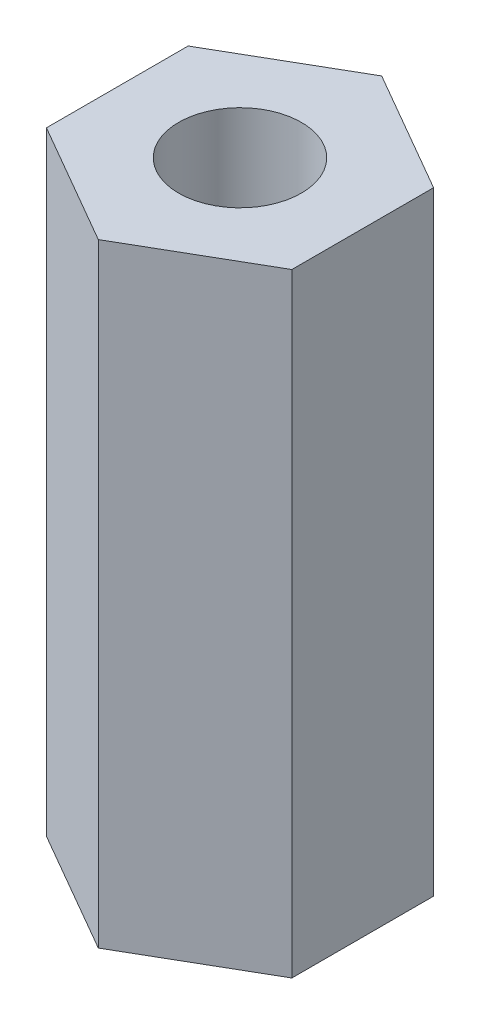
ISO-10303-21;
HEADER;
FILE_DESCRIPTION(('STEP AP214'),'2;1');
FILE_NAME('part.step','',(''),(''),'','','');
FILE_SCHEMA(('AUTOMOTIVE_DESIGN { 1 0 10303 214 1 1 1 1 }'));
ENDSEC;
DATA;
#1=APPLICATION_CONTEXT('core data for automotive mechanical design processes');
#2=APPLICATION_PROTOCOL_DEFINITION('international standard','automotive_design',2000,#1);
#3=PRODUCT_CONTEXT('',#1,'mechanical');
#4=PRODUCT('Part','Part','',(#3));
#5=PRODUCT_RELATED_PRODUCT_CATEGORY('part','',(#4));
#6=PRODUCT_DEFINITION_FORMATION('','',#4);
#7=PRODUCT_DEFINITION_CONTEXT('part definition',#1,'design');
#8=PRODUCT_DEFINITION('design','',#6,#7);
#9=PRODUCT_DEFINITION_SHAPE('','',#8);
#10=(LENGTH_UNIT() NAMED_UNIT(*) SI_UNIT(.MILLI.,.METRE.));
#11=(NAMED_UNIT(*) PLANE_ANGLE_UNIT() SI_UNIT($,.RADIAN.));
#12=(NAMED_UNIT(*) SI_UNIT($,.STERADIAN.) SOLID_ANGLE_UNIT());
#13=UNCERTAINTY_MEASURE_WITH_UNIT(LENGTH_MEASURE(1.E-05),#10,'distance_accuracy_value','');
#14=(GEOMETRIC_REPRESENTATION_CONTEXT(3) GLOBAL_UNCERTAINTY_ASSIGNED_CONTEXT((#13)) GLOBAL_UNIT_ASSIGNED_CONTEXT((#10,
#11,#12)) REPRESENTATION_CONTEXT('',''));
#15=CARTESIAN_POINT('',(0.,0.,0.));
#16=DIRECTION('',(0.,0.,1.));
#17=DIRECTION('',(1.,0.,0.));
#18=AXIS2_PLACEMENT_3D('',#15,#16,#17);
#19=CARTESIAN_POINT('',(0.,15.,0.));
#20=DIRECTION('',(0.,1.,0.));
#21=DIRECTION('',(0.,0.,1.));
#22=AXIS2_PLACEMENT_3D('',#19,#20,#21);
#23=PLANE('',#22);
#24=DIRECTION('',(-0.866025403784442,0.,-0.499999999999995));
#25=VECTOR('',#24,1.);
#26=CARTESIAN_POINT('',(2.99999999999998,15.,-1.73205080756891));
#27=LINE('',#26,#25);
#28=CARTESIAN_POINT('',(2.99999999999998,15.,-1.73205080756891));
#29=VERTEX_POINT('',#28);
#30=CARTESIAN_POINT('',(0.,15.,-3.46410161513776));
#31=VERTEX_POINT('',#30);
#32=EDGE_CURVE('E148',#29,#31,#27,.T.);
#33=ORIENTED_EDGE('',*,*,#32,.T.);
#34=DIRECTION('',(-0.866025403784438,0.,0.500000000000001));
#35=VECTOR('',#34,1.);
#36=CARTESIAN_POINT('',(0.,15.,-3.46410161513776));
#37=LINE('',#36,#35);
#38=CARTESIAN_POINT('',(-3.00000000000001,15.,-1.73205080756887));
#39=VERTEX_POINT('',#38);
#40=EDGE_CURVE('E96',#31,#39,#37,.T.);
#41=ORIENTED_EDGE('',*,*,#40,.T.);
#42=DIRECTION('',(0.,0.,1.));
#43=VECTOR('',#42,1.);
#44=CARTESIAN_POINT('',(-3.00000000000001,15.,-1.73205080756887));
#45=LINE('',#44,#43);
#46=CARTESIAN_POINT('',(-2.99999999999999,15.,1.73205080756889));
#47=VERTEX_POINT('',#46);
#48=EDGE_CURVE('E109',#39,#47,#45,.T.);
#49=ORIENTED_EDGE('',*,*,#48,.T.);
#50=DIRECTION('',(0.866025403784442,0.,0.499999999999995));
#51=VECTOR('',#50,1.);
#52=CARTESIAN_POINT('',(-2.99999999999999,15.,1.73205080756889));
#53=LINE('',#52,#51);
#54=CARTESIAN_POINT('',(0.,15.,3.46410161513776));
#55=VERTEX_POINT('',#54);
#56=EDGE_CURVE('E103',#47,#55,#53,.T.);
#57=ORIENTED_EDGE('',*,*,#56,.T.);
#58=DIRECTION('',(0.866025403784435,0.,-0.500000000000007));
#59=VECTOR('',#58,1.);
#60=CARTESIAN_POINT('',(0.,15.,3.46410161513776));
#61=LINE('',#60,#59);
#62=CARTESIAN_POINT('',(3.00000000000002,15.,1.73205080756885));
#63=VERTEX_POINT('',#62);
#64=EDGE_CURVE('E107',#55,#63,#61,.T.);
#65=ORIENTED_EDGE('',*,*,#64,.T.);
#66=DIRECTION('',(0.,0.,-1.));
#67=VECTOR('',#66,1.);
#68=CARTESIAN_POINT('',(3.00000000000002,15.,1.73205080756885));
#69=LINE('',#68,#67);
#70=EDGE_CURVE('E59',#63,#29,#69,.T.);
#71=ORIENTED_EDGE('',*,*,#70,.T.);
#72=EDGE_LOOP('',(#33,#41,#49,#57,#65,#71));
#73=FACE_BOUND('',#72,.T.);
#74=CARTESIAN_POINT('',(0.,15.,0.));
#75=DIRECTION('',(0.,1.,0.));
#76=DIRECTION('',(0.,0.,1.));
#77=AXIS2_PLACEMENT_3D('',#74,#75,#76);
#78=CIRCLE('',#77,1.5);
#79=CARTESIAN_POINT('',(0.,15.,1.5));
#80=VERTEX_POINT('',#79);
#81=EDGE_CURVE('E136',#80,#80,#78,.T.);
#82=ORIENTED_EDGE('',*,*,#81,.F.);
#83=EDGE_LOOP('',(#82));
#84=FACE_BOUND('',#83,.T.);
#85=ADVANCED_FACE('F41',(#73,#84),#23,.T.);
#86=CARTESIAN_POINT('',(0.,0.,0.));
#87=DIRECTION('',(0.,1.,0.));
#88=DIRECTION('',(0.,0.,1.));
#89=AXIS2_PLACEMENT_3D('',#86,#87,#88);
#90=PLANE('',#89);
#91=DIRECTION('',(-0.866025403784442,0.,-0.499999999999995));
#92=VECTOR('',#91,1.);
#93=CARTESIAN_POINT('',(2.99999999999998,0.,-1.73205080756891));
#94=LINE('',#93,#92);
#95=CARTESIAN_POINT('',(2.99999999999998,0.,-1.73205080756891));
#96=VERTEX_POINT('',#95);
#97=CARTESIAN_POINT('',(0.,0.,-3.46410161513776));
#98=VERTEX_POINT('',#97);
#99=EDGE_CURVE('E131',#96,#98,#94,.T.);
#100=ORIENTED_EDGE('',*,*,#99,.F.);
#101=DIRECTION('',(0.,0.,-1.));
#102=VECTOR('',#101,1.);
#103=CARTESIAN_POINT('',(3.00000000000002,0.,1.73205080756885));
#104=LINE('',#103,#102);
#105=CARTESIAN_POINT('',(3.00000000000002,0.,1.73205080756885));
#106=VERTEX_POINT('',#105);
#107=EDGE_CURVE('E88',#106,#96,#104,.T.);
#108=ORIENTED_EDGE('',*,*,#107,.F.);
#109=DIRECTION('',(0.866025403784435,0.,-0.500000000000007));
#110=VECTOR('',#109,1.);
#111=CARTESIAN_POINT('',(0.,0.,3.46410161513776));
#112=LINE('',#111,#110);
#113=CARTESIAN_POINT('',(0.,0.,3.46410161513776));
#114=VERTEX_POINT('',#113);
#115=EDGE_CURVE('E82',#114,#106,#112,.T.);
#116=ORIENTED_EDGE('',*,*,#115,.F.);
#117=DIRECTION('',(0.866025403784442,0.,0.499999999999995));
#118=VECTOR('',#117,1.);
#119=CARTESIAN_POINT('',(-2.99999999999999,0.,1.73205080756889));
#120=LINE('',#119,#118);
#121=CARTESIAN_POINT('',(-2.99999999999999,0.,1.73205080756889));
#122=VERTEX_POINT('',#121);
#123=EDGE_CURVE('E118',#122,#114,#120,.T.);
#124=ORIENTED_EDGE('',*,*,#123,.F.);
#125=DIRECTION('',(0.,0.,1.));
#126=VECTOR('',#125,1.);
#127=CARTESIAN_POINT('',(-3.00000000000001,0.,-1.73205080756887));
#128=LINE('',#127,#126);
#129=CARTESIAN_POINT('',(-3.00000000000001,0.,-1.73205080756887));
#130=VERTEX_POINT('',#129);
#131=EDGE_CURVE('E139',#130,#122,#128,.T.);
#132=ORIENTED_EDGE('',*,*,#131,.F.);
#133=DIRECTION('',(-0.866025403784438,0.,0.500000000000001));
#134=VECTOR('',#133,1.);
#135=CARTESIAN_POINT('',(0.,0.,-3.46410161513776));
#136=LINE('',#135,#134);
#137=EDGE_CURVE('E135',#98,#130,#136,.T.);
#138=ORIENTED_EDGE('',*,*,#137,.F.);
#139=EDGE_LOOP('',(#100,#108,#116,#124,#132,#138));
#140=FACE_BOUND('',#139,.T.);
#141=CARTESIAN_POINT('',(0.,0.,0.));
#142=DIRECTION('',(0.,1.,0.));
#143=DIRECTION('',(0.,0.,1.));
#144=AXIS2_PLACEMENT_3D('',#141,#142,#143);
#145=CIRCLE('',#144,1.5);
#146=CARTESIAN_POINT('',(0.,0.,1.5));
#147=VERTEX_POINT('',#146);
#148=EDGE_CURVE('E245',#147,#147,#145,.T.);
#149=ORIENTED_EDGE('',*,*,#148,.T.);
#150=EDGE_LOOP('',(#149));
#151=FACE_BOUND('',#150,.T.);
#152=ADVANCED_FACE('F161',(#140,#151),#90,.F.);
#153=CARTESIAN_POINT('',(2.99999999999998,15.,-1.73205080756891));
#154=DIRECTION('',(-0.499999999999995,0.,0.866025403784442));
#155=DIRECTION('',(0.866025403784442,0.,0.499999999999995));
#156=AXIS2_PLACEMENT_3D('',#153,#154,#155);
#157=PLANE('',#156);
#158=ORIENTED_EDGE('',*,*,#99,.T.);
#159=DIRECTION('',(0.,-1.,0.));
#160=VECTOR('',#159,1.);
#161=CARTESIAN_POINT('',(0.,15.,-3.46410161513776));
#162=LINE('',#161,#160);
#163=EDGE_CURVE('E11',#31,#98,#162,.T.);
#164=ORIENTED_EDGE('',*,*,#163,.F.);
#165=ORIENTED_EDGE('',*,*,#32,.F.);
#166=DIRECTION('',(0.,-1.,0.));
#167=VECTOR('',#166,1.);
#168=CARTESIAN_POINT('',(2.99999999999998,15.,-1.73205080756891));
#169=LINE('',#168,#167);
#170=EDGE_CURVE('E127',#29,#96,#169,.T.);
#171=ORIENTED_EDGE('',*,*,#170,.T.);
#172=EDGE_LOOP('',(#158,#164,#165,#171));
#173=FACE_BOUND('',#172,.T.);
#174=ADVANCED_FACE('F43',(#173),#157,.F.);
#175=CARTESIAN_POINT('',(0.,15.,-3.46410161513776));
#176=DIRECTION('',(0.500000000000001,0.,0.866025403784438));
#177=DIRECTION('',(0.866025403784438,0.,-0.500000000000001));
#178=AXIS2_PLACEMENT_3D('',#175,#176,#177);
#179=PLANE('',#178);
#180=ORIENTED_EDGE('',*,*,#137,.T.);
#181=DIRECTION('',(0.,-1.,0.));
#182=VECTOR('',#181,1.);
#183=CARTESIAN_POINT('',(-3.00000000000001,15.,-1.73205080756887));
#184=LINE('',#183,#182);
#185=EDGE_CURVE('E51',#39,#130,#184,.T.);
#186=ORIENTED_EDGE('',*,*,#185,.F.);
#187=ORIENTED_EDGE('',*,*,#40,.F.);
#188=ORIENTED_EDGE('',*,*,#163,.T.);
#189=EDGE_LOOP('',(#180,#186,#187,#188));
#190=FACE_BOUND('',#189,.T.);
#191=ADVANCED_FACE('F186',(#190),#179,.F.);
#192=CARTESIAN_POINT('',(-3.00000000000001,15.,-1.73205080756887));
#193=DIRECTION('',(1.,0.,0.));
#194=DIRECTION('',(0.,0.,-1.));
#195=AXIS2_PLACEMENT_3D('',#192,#193,#194);
#196=PLANE('',#195);
#197=ORIENTED_EDGE('',*,*,#131,.T.);
#198=DIRECTION('',(0.,-1.,0.));
#199=VECTOR('',#198,1.);
#200=CARTESIAN_POINT('',(-2.99999999999999,15.,1.73205080756889));
#201=LINE('',#200,#199);
#202=EDGE_CURVE('E120',#47,#122,#201,.T.);
#203=ORIENTED_EDGE('',*,*,#202,.F.);
#204=ORIENTED_EDGE('',*,*,#48,.F.);
#205=ORIENTED_EDGE('',*,*,#185,.T.);
#206=EDGE_LOOP('',(#197,#203,#204,#205));
#207=FACE_BOUND('',#206,.T.);
#208=ADVANCED_FACE('F158',(#207),#196,.F.);
#209=CARTESIAN_POINT('',(-2.99999999999999,15.,1.73205080756889));
#210=DIRECTION('',(0.499999999999995,0.,-0.866025403784442));
#211=DIRECTION('',(-0.866025403784442,0.,-0.499999999999995));
#212=AXIS2_PLACEMENT_3D('',#209,#210,#211);
#213=PLANE('',#212);
#214=ORIENTED_EDGE('',*,*,#123,.T.);
#215=DIRECTION('',(0.,-1.,0.));
#216=VECTOR('',#215,1.);
#217=CARTESIAN_POINT('',(0.,15.,3.46410161513776));
#218=LINE('',#217,#216);
#219=EDGE_CURVE('E115',#55,#114,#218,.T.);
#220=ORIENTED_EDGE('',*,*,#219,.F.);
#221=ORIENTED_EDGE('',*,*,#56,.F.);
#222=ORIENTED_EDGE('',*,*,#202,.T.);
#223=EDGE_LOOP('',(#214,#220,#221,#222));
#224=FACE_BOUND('',#223,.T.);
#225=ADVANCED_FACE('F116',(#224),#213,.F.);
#226=CARTESIAN_POINT('',(0.,15.,3.46410161513776));
#227=DIRECTION('',(-0.500000000000007,0.,-0.866025403784435));
#228=DIRECTION('',(-0.866025403784435,0.,0.500000000000007));
#229=AXIS2_PLACEMENT_3D('',#226,#227,#228);
#230=PLANE('',#229);
#231=ORIENTED_EDGE('',*,*,#115,.T.);
#232=DIRECTION('',(0.,-1.,0.));
#233=VECTOR('',#232,1.);
#234=CARTESIAN_POINT('',(3.00000000000002,15.,1.73205080756885));
#235=LINE('',#234,#233);
#236=EDGE_CURVE('E121',#63,#106,#235,.T.);
#237=ORIENTED_EDGE('',*,*,#236,.F.);
#238=ORIENTED_EDGE('',*,*,#64,.F.);
#239=ORIENTED_EDGE('',*,*,#219,.T.);
#240=EDGE_LOOP('',(#231,#237,#238,#239));
#241=FACE_BOUND('',#240,.T.);
#242=ADVANCED_FACE('F123',(#241),#230,.F.);
#243=CARTESIAN_POINT('',(3.00000000000002,15.,1.73205080756885));
#244=DIRECTION('',(-1.,0.,0.));
#245=DIRECTION('',(0.,0.,1.));
#246=AXIS2_PLACEMENT_3D('',#243,#244,#245);
#247=PLANE('',#246);
#248=ORIENTED_EDGE('',*,*,#107,.T.);
#249=ORIENTED_EDGE('',*,*,#170,.F.);
#250=ORIENTED_EDGE('',*,*,#70,.F.);
#251=ORIENTED_EDGE('',*,*,#236,.T.);
#252=EDGE_LOOP('',(#248,#249,#250,#251));
#253=FACE_BOUND('',#252,.T.);
#254=ADVANCED_FACE('F166',(#253),#247,.F.);
#255=CARTESIAN_POINT('',(0.,15.,0.));
#256=DIRECTION('',(0.,-1.,0.));
#257=DIRECTION('',(0.,0.,-1.));
#258=AXIS2_PLACEMENT_3D('',#255,#256,#257);
#259=CYLINDRICAL_SURFACE('',#258,1.5);
#260=ORIENTED_EDGE('',*,*,#81,.T.);
#261=EDGE_LOOP('',(#260));
#262=FACE_BOUND('',#261,.T.);
#263=ORIENTED_EDGE('',*,*,#148,.F.);
#264=EDGE_LOOP('',(#263));
#265=FACE_BOUND('',#264,.T.);
#266=ADVANCED_FACE('F168',(#262,#265),#259,.F.);
#267=CLOSED_SHELL('',(#85,#152,#174,#191,#208,#225,#242,#254,#266));
#268=MANIFOLD_SOLID_BREP('B2',#267);
#269=ADVANCED_BREP_SHAPE_REPRESENTATION('',(#18,#268),#14);
#270=SHAPE_DEFINITION_REPRESENTATION(#9,#269);
ENDSEC;
END-ISO-10303-21;
